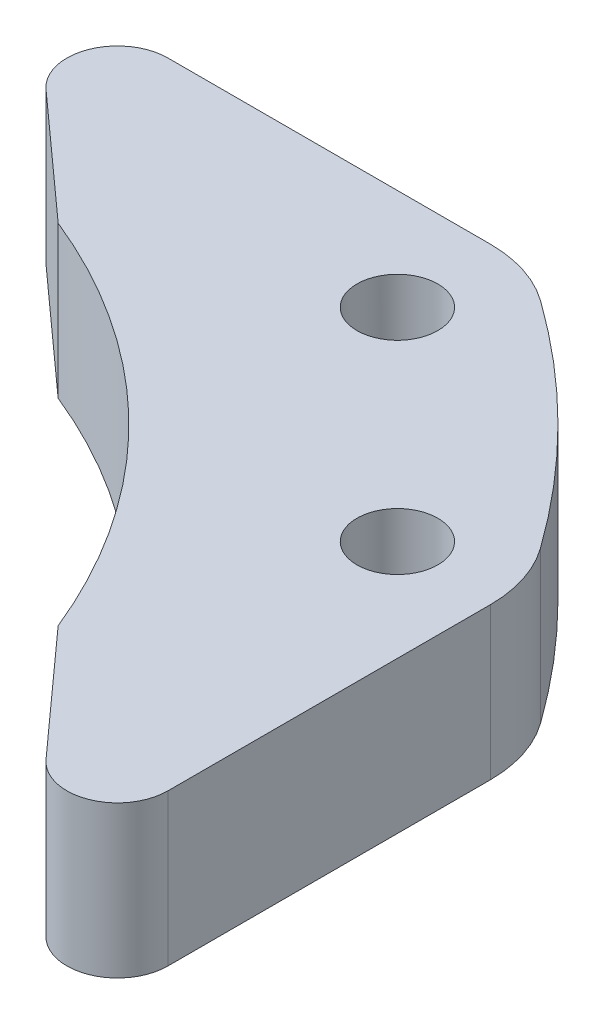
ISO-10303-21;
HEADER;
FILE_DESCRIPTION(('STEP AP214'),'2;1');
FILE_NAME('part.step','',(''),(''),'','','');
FILE_SCHEMA(('AUTOMOTIVE_DESIGN { 1 0 10303 214 1 1 1 1 }'));
ENDSEC;
DATA;
#1=APPLICATION_CONTEXT('core data for automotive mechanical design processes');
#2=APPLICATION_PROTOCOL_DEFINITION('international standard','automotive_design',2000,#1);
#3=PRODUCT_CONTEXT('',#1,'mechanical');
#4=PRODUCT('Part','Part','',(#3));
#5=PRODUCT_RELATED_PRODUCT_CATEGORY('part','',(#4));
#6=PRODUCT_DEFINITION_FORMATION('','',#4);
#7=PRODUCT_DEFINITION_CONTEXT('part definition',#1,'design');
#8=PRODUCT_DEFINITION('design','',#6,#7);
#9=PRODUCT_DEFINITION_SHAPE('','',#8);
#10=(LENGTH_UNIT() NAMED_UNIT(*) SI_UNIT(.MILLI.,.METRE.));
#11=(NAMED_UNIT(*) PLANE_ANGLE_UNIT() SI_UNIT($,.RADIAN.));
#12=(NAMED_UNIT(*) SI_UNIT($,.STERADIAN.) SOLID_ANGLE_UNIT());
#13=UNCERTAINTY_MEASURE_WITH_UNIT(LENGTH_MEASURE(1.E-05),#10,'distance_accuracy_value','');
#14=(GEOMETRIC_REPRESENTATION_CONTEXT(3) GLOBAL_UNCERTAINTY_ASSIGNED_CONTEXT((#13)) GLOBAL_UNIT_ASSIGNED_CONTEXT((#10,
#11,#12)) REPRESENTATION_CONTEXT('',''));
#15=CARTESIAN_POINT('',(0.,0.,0.));
#16=DIRECTION('',(0.,0.,1.));
#17=DIRECTION('',(1.,0.,0.));
#18=AXIS2_PLACEMENT_3D('',#15,#16,#17);
#19=CARTESIAN_POINT('',(31.,6.,-20.1990098767242));
#20=DIRECTION('',(-1.,0.,0.));
#21=DIRECTION('',(0.,0.,1.));
#22=AXIS2_PLACEMENT_3D('',#19,#20,#21);
#23=PLANE('',#22);
#24=DIRECTION('',(0.,0.,-1.));
#25=VECTOR('',#24,1.);
#26=CARTESIAN_POINT('',(31.,6.,-20.1990098767242));
#27=LINE('',#26,#25);
#28=CARTESIAN_POINT('',(31.,6.,-5.90138909150087));
#29=VERTEX_POINT('',#28);
#30=CARTESIAN_POINT('',(31.,6.,-18.6547581061776));
#31=VERTEX_POINT('',#30);
#32=EDGE_CURVE('E163',#29,#31,#27,.T.);
#33=ORIENTED_EDGE('',*,*,#32,.F.);
#34=DIRECTION('',(0.,1.,0.));
#35=VECTOR('',#34,1.);
#36=CARTESIAN_POINT('',(31.,0.,-5.90138909150087));
#37=LINE('',#36,#35);
#38=CARTESIAN_POINT('',(31.,0.,-5.90138909150087));
#39=VERTEX_POINT('',#38);
#40=EDGE_CURVE('E235',#29,#39,#37,.F.);
#41=ORIENTED_EDGE('',*,*,#40,.T.);
#42=DIRECTION('',(0.,0.,-1.));
#43=VECTOR('',#42,1.);
#44=CARTESIAN_POINT('',(31.,0.,-20.1990098767242));
#45=LINE('',#44,#43);
#46=CARTESIAN_POINT('',(31.,0.,-18.6547581061776));
#47=VERTEX_POINT('',#46);
#48=EDGE_CURVE('E174',#39,#47,#45,.T.);
#49=ORIENTED_EDGE('',*,*,#48,.T.);
#50=DIRECTION('',(0.,-1.,0.));
#51=VECTOR('',#50,1.);
#52=CARTESIAN_POINT('',(31.,6.,-18.6547581061776));
#53=LINE('',#52,#51);
#54=EDGE_CURVE('E212',#47,#31,#53,.F.);
#55=ORIENTED_EDGE('',*,*,#54,.T.);
#56=EDGE_LOOP('',(#33,#41,#49,#55));
#57=FACE_BOUND('',#56,.T.);
#58=ADVANCED_FACE('F46',(#57),#23,.F.);
#59=CARTESIAN_POINT('',(-20.1990098767242,6.,-31.));
#60=DIRECTION('',(0.,0.,1.));
#61=DIRECTION('',(1.,0.,0.));
#62=AXIS2_PLACEMENT_3D('',#59,#60,#61);
#63=PLANE('',#62);
#64=DIRECTION('',(-1.,0.,0.));
#65=VECTOR('',#64,1.);
#66=CARTESIAN_POINT('',(-20.1990098767242,0.,-31.));
#67=LINE('',#66,#65);
#68=CARTESIAN_POINT('',(18.6547581061776,0.,-31.));
#69=VERTEX_POINT('',#68);
#70=CARTESIAN_POINT('',(5.90138909150088,0.,-31.));
#71=VERTEX_POINT('',#70);
#72=EDGE_CURVE('E167',#69,#71,#67,.T.);
#73=ORIENTED_EDGE('',*,*,#72,.T.);
#74=DIRECTION('',(0.,1.,0.));
#75=VECTOR('',#74,1.);
#76=CARTESIAN_POINT('',(5.90138909150088,6.,-31.));
#77=LINE('',#76,#75);
#78=CARTESIAN_POINT('',(5.90138909150088,6.,-31.));
#79=VERTEX_POINT('',#78);
#80=EDGE_CURVE('E55',#71,#79,#77,.T.);
#81=ORIENTED_EDGE('',*,*,#80,.T.);
#82=DIRECTION('',(-1.,0.,0.));
#83=VECTOR('',#82,1.);
#84=CARTESIAN_POINT('',(-20.1990098767242,6.,-31.));
#85=LINE('',#84,#83);
#86=CARTESIAN_POINT('',(18.6547581061776,6.,-31.));
#87=VERTEX_POINT('',#86);
#88=EDGE_CURVE('E171',#87,#79,#85,.T.);
#89=ORIENTED_EDGE('',*,*,#88,.F.);
#90=DIRECTION('',(0.,-1.,0.));
#91=VECTOR('',#90,1.);
#92=CARTESIAN_POINT('',(18.6547581061776,6.,-31.));
#93=LINE('',#92,#91);
#94=EDGE_CURVE('E222',#87,#69,#93,.T.);
#95=ORIENTED_EDGE('',*,*,#94,.T.);
#96=EDGE_LOOP('',(#73,#81,#89,#95));
#97=FACE_BOUND('',#96,.T.);
#98=ADVANCED_FACE('F247',(#97),#63,.F.);
#99=CARTESIAN_POINT('',(0.,6.,0.));
#100=DIRECTION('',(0.,1.,0.));
#101=DIRECTION('',(0.,0.,1.));
#102=AXIS2_PLACEMENT_3D('',#99,#100,#101);
#103=PLANE('',#102);
#104=CARTESIAN_POINT('',(26.9989406750258,6.,-18.9751733174282));
#105=DIRECTION('',(0.,1.,0.));
#106=DIRECTION('',(0.,0.,1.));
#107=AXIS2_PLACEMENT_3D('',#104,#105,#106);
#108=CIRCLE('',#107,1.6);
#109=CARTESIAN_POINT('',(26.9989406750258,6.,-17.3751733174282));
#110=VERTEX_POINT('',#109);
#111=EDGE_CURVE('E155',#110,#110,#108,.T.);
#112=ORIENTED_EDGE('',*,*,#111,.F.);
#113=EDGE_LOOP('',(#112));
#114=FACE_BOUND('',#113,.T.);
#115=CARTESIAN_POINT('',(18.9751733174281,6.,-26.9989406750258));
#116=DIRECTION('',(0.,1.,0.));
#117=DIRECTION('',(0.,0.,-1.));
#118=AXIS2_PLACEMENT_3D('',#115,#116,#117);
#119=CIRCLE('',#118,1.60000000000001);
#120=CARTESIAN_POINT('',(18.9751733174281,6.,-28.5989406750258));
#121=VERTEX_POINT('',#120);
#122=EDGE_CURVE('E153',#121,#121,#119,.T.);
#123=ORIENTED_EDGE('',*,*,#122,.F.);
#124=EDGE_LOOP('',(#123));
#125=FACE_BOUND('',#124,.T.);
#126=DIRECTION('',(0.669130606358857,0.,0.743144825477396));
#127=VECTOR('',#126,1.);
#128=CARTESIAN_POINT('',(31.,6.,-0.691210962113258));
#129=LINE('',#128,#127);
#130=CARTESIAN_POINT('',(23.1711599330476,6.,-9.38601871706681));
#131=VERTEX_POINT('',#130);
#132=CARTESIAN_POINT('',(27.5137103490452,6.,-4.56312787878316));
#133=VERTEX_POINT('',#132);
#134=EDGE_CURVE('E141',#131,#133,#129,.T.);
#135=ORIENTED_EDGE('',*,*,#134,.T.);
#136=CARTESIAN_POINT('',(29.,6.,-5.90138909150087));
#137=DIRECTION('',(0.,1.,0.));
#138=DIRECTION('',(0.,0.,1.));
#139=AXIS2_PLACEMENT_3D('',#136,#137,#138);
#140=CIRCLE('',#139,2.);
#141=EDGE_CURVE('E232',#133,#29,#140,.T.);
#142=ORIENTED_EDGE('',*,*,#141,.T.);
#143=ORIENTED_EDGE('',*,*,#32,.T.);
#144=CARTESIAN_POINT('',(26.,6.,-18.6547581061776));
#145=DIRECTION('',(0.,1.,0.));
#146=DIRECTION('',(0.,0.,1.));
#147=AXIS2_PLACEMENT_3D('',#144,#145,#146);
#148=CIRCLE('',#147,5.);
#149=CARTESIAN_POINT('',(30.0625,6.,-21.5695640602679));
#150=VERTEX_POINT('',#149);
#151=EDGE_CURVE('E219',#31,#150,#148,.T.);
#152=ORIENTED_EDGE('',*,*,#151,.T.);
#153=CARTESIAN_POINT('',(0.,6.,0.));
#154=DIRECTION('',(0.,1.,0.));
#155=DIRECTION('',(0.,0.,1.));
#156=AXIS2_PLACEMENT_3D('',#153,#154,#155);
#157=CIRCLE('',#156,37.);
#158=CARTESIAN_POINT('',(21.5695640602679,6.,-30.0625));
#159=VERTEX_POINT('',#158);
#160=EDGE_CURVE('E166',#150,#159,#157,.T.);
#161=ORIENTED_EDGE('',*,*,#160,.T.);
#162=CARTESIAN_POINT('',(18.6547581061776,6.,-26.));
#163=DIRECTION('',(0.,1.,0.));
#164=DIRECTION('',(0.,0.,1.));
#165=AXIS2_PLACEMENT_3D('',#162,#163,#164);
#166=CIRCLE('',#165,5.);
#167=EDGE_CURVE('E216',#159,#87,#166,.T.);
#168=ORIENTED_EDGE('',*,*,#167,.T.);
#169=ORIENTED_EDGE('',*,*,#88,.T.);
#170=CARTESIAN_POINT('',(5.90138909150088,6.,-29.));
#171=DIRECTION('',(0.,1.,0.));
#172=DIRECTION('',(0.,0.,1.));
#173=AXIS2_PLACEMENT_3D('',#170,#171,#172);
#174=CIRCLE('',#173,2.);
#175=CARTESIAN_POINT('',(4.56312787878316,6.,-27.5137103490452));
#176=VERTEX_POINT('',#175);
#177=EDGE_CURVE('E130',#79,#176,#174,.T.);
#178=ORIENTED_EDGE('',*,*,#177,.T.);
#179=DIRECTION('',(0.743144825477395,0.,0.669130606358857));
#180=VECTOR('',#179,1.);
#181=CARTESIAN_POINT('',(0.691210962113255,6.,-31.));
#182=LINE('',#181,#180);
#183=CARTESIAN_POINT('',(9.38601871706681,6.,-23.1711599330476));
#184=VERTEX_POINT('',#183);
#185=EDGE_CURVE('E123',#176,#184,#182,.T.);
#186=ORIENTED_EDGE('',*,*,#185,.T.);
#187=CARTESIAN_POINT('',(0.,6.,0.));
#188=DIRECTION('',(0.,-1.,0.));
#189=DIRECTION('',(0.,0.,1.));
#190=AXIS2_PLACEMENT_3D('',#187,#188,#189);
#191=CIRCLE('',#190,25.);
#192=EDGE_CURVE('E128',#184,#131,#191,.T.);
#193=ORIENTED_EDGE('',*,*,#192,.T.);
#194=EDGE_LOOP('',(#135,#142,#143,#152,#161,#168,#169,#178,#186,#193));
#195=FACE_BOUND('',#194,.T.);
#196=ADVANCED_FACE('F126',(#114,#125,#195),#103,.T.);
#197=CARTESIAN_POINT('',(0.,0.,0.));
#198=DIRECTION('',(0.,1.,0.));
#199=DIRECTION('',(0.,0.,1.));
#200=AXIS2_PLACEMENT_3D('',#197,#198,#199);
#201=PLANE('',#200);
#202=CARTESIAN_POINT('',(18.9751733174281,0.,-26.9989406750258));
#203=DIRECTION('',(0.,1.,0.));
#204=DIRECTION('',(0.,0.,1.));
#205=AXIS2_PLACEMENT_3D('',#202,#203,#204);
#206=CIRCLE('',#205,1.60000000000001);
#207=CARTESIAN_POINT('',(18.9751733174281,0.,-25.3989406750258));
#208=VERTEX_POINT('',#207);
#209=EDGE_CURVE('E159',#208,#208,#206,.T.);
#210=ORIENTED_EDGE('',*,*,#209,.T.);
#211=EDGE_LOOP('',(#210));
#212=FACE_BOUND('',#211,.T.);
#213=CARTESIAN_POINT('',(26.9989406750258,0.,-18.9751733174282));
#214=DIRECTION('',(0.,1.,0.));
#215=DIRECTION('',(0.,0.,1.));
#216=AXIS2_PLACEMENT_3D('',#213,#214,#215);
#217=CIRCLE('',#216,1.6);
#218=CARTESIAN_POINT('',(26.9989406750258,0.,-17.3751733174282));
#219=VERTEX_POINT('',#218);
#220=EDGE_CURVE('E178',#219,#219,#217,.T.);
#221=ORIENTED_EDGE('',*,*,#220,.T.);
#222=EDGE_LOOP('',(#221));
#223=FACE_BOUND('',#222,.T.);
#224=ORIENTED_EDGE('',*,*,#48,.F.);
#225=CARTESIAN_POINT('',(29.,0.,-5.90138909150087));
#226=DIRECTION('',(0.,1.,0.));
#227=DIRECTION('',(0.,0.,1.));
#228=AXIS2_PLACEMENT_3D('',#225,#226,#227);
#229=CIRCLE('',#228,2.);
#230=CARTESIAN_POINT('',(27.5137103490452,0.,-4.56312787878316));
#231=VERTEX_POINT('',#230);
#232=EDGE_CURVE('E240',#39,#231,#229,.F.);
#233=ORIENTED_EDGE('',*,*,#232,.T.);
#234=DIRECTION('',(0.669130606358857,0.,0.743144825477396));
#235=VECTOR('',#234,1.);
#236=CARTESIAN_POINT('',(17.4639033987188,0.,-15.7245692494331));
#237=LINE('',#236,#235);
#238=CARTESIAN_POINT('',(23.1711599330476,0.,-9.38601871706681));
#239=VERTEX_POINT('',#238);
#240=EDGE_CURVE('E194',#239,#231,#237,.T.);
#241=ORIENTED_EDGE('',*,*,#240,.F.);
#242=CARTESIAN_POINT('',(0.,0.,0.));
#243=DIRECTION('',(0.,1.,0.));
#244=DIRECTION('',(0.,0.,1.));
#245=AXIS2_PLACEMENT_3D('',#242,#243,#244);
#246=CIRCLE('',#245,25.);
#247=CARTESIAN_POINT('',(9.38601871706681,0.,-23.1711599330476));
#248=VERTEX_POINT('',#247);
#249=EDGE_CURVE('E192',#248,#239,#246,.F.);
#250=ORIENTED_EDGE('',*,*,#249,.F.);
#251=DIRECTION('',(0.743144825477396,0.,0.669130606358857));
#252=VECTOR('',#251,1.);
#253=CARTESIAN_POINT('',(15.7245692494331,0.,-17.4639033987188));
#254=LINE('',#253,#252);
#255=CARTESIAN_POINT('',(4.56312787878316,0.,-27.5137103490452));
#256=VERTEX_POINT('',#255);
#257=EDGE_CURVE('E136',#256,#248,#254,.T.);
#258=ORIENTED_EDGE('',*,*,#257,.F.);
#259=CARTESIAN_POINT('',(5.90138909150088,0.,-29.));
#260=DIRECTION('',(0.,1.,0.));
#261=DIRECTION('',(0.,0.,1.));
#262=AXIS2_PLACEMENT_3D('',#259,#260,#261);
#263=CIRCLE('',#262,2.);
#264=EDGE_CURVE('E62',#256,#71,#263,.F.);
#265=ORIENTED_EDGE('',*,*,#264,.T.);
#266=ORIENTED_EDGE('',*,*,#72,.F.);
#267=CARTESIAN_POINT('',(18.6547581061776,0.,-26.));
#268=DIRECTION('',(0.,1.,0.));
#269=DIRECTION('',(0.,0.,1.));
#270=AXIS2_PLACEMENT_3D('',#267,#268,#269);
#271=CIRCLE('',#270,5.);
#272=CARTESIAN_POINT('',(21.5695640602679,0.,-30.0625));
#273=VERTEX_POINT('',#272);
#274=EDGE_CURVE('E205',#69,#273,#271,.F.);
#275=ORIENTED_EDGE('',*,*,#274,.T.);
#276=CARTESIAN_POINT('',(0.,0.,0.));
#277=DIRECTION('',(0.,1.,0.));
#278=DIRECTION('',(0.,0.,1.));
#279=AXIS2_PLACEMENT_3D('',#276,#277,#278);
#280=CIRCLE('',#279,37.);
#281=CARTESIAN_POINT('',(30.0625,0.,-21.5695640602679));
#282=VERTEX_POINT('',#281);
#283=EDGE_CURVE('E177',#282,#273,#280,.T.);
#284=ORIENTED_EDGE('',*,*,#283,.F.);
#285=CARTESIAN_POINT('',(26.,0.,-18.6547581061776));
#286=DIRECTION('',(0.,1.,0.));
#287=DIRECTION('',(0.,0.,1.));
#288=AXIS2_PLACEMENT_3D('',#285,#286,#287);
#289=CIRCLE('',#288,5.);
#290=EDGE_CURVE('E208',#282,#47,#289,.F.);
#291=ORIENTED_EDGE('',*,*,#290,.T.);
#292=EDGE_LOOP('',(#224,#233,#241,#250,#258,#265,#266,#275,#284,#291));
#293=FACE_BOUND('',#292,.T.);
#294=ADVANCED_FACE('F256',(#212,#223,#293),#201,.F.);
#295=CARTESIAN_POINT('',(0.,6.,0.));
#296=DIRECTION('',(0.,-1.,0.));
#297=DIRECTION('',(0.,0.,-1.));
#298=AXIS2_PLACEMENT_3D('',#295,#296,#297);
#299=CYLINDRICAL_SURFACE('',#298,37.);
#300=ORIENTED_EDGE('',*,*,#160,.F.);
#301=DIRECTION('',(0.,-1.,0.));
#302=VECTOR('',#301,1.);
#303=CARTESIAN_POINT('',(30.0625,6.,-21.5695640602679));
#304=LINE('',#303,#302);
#305=EDGE_CURVE('E201',#150,#282,#304,.T.);
#306=ORIENTED_EDGE('',*,*,#305,.T.);
#307=ORIENTED_EDGE('',*,*,#283,.T.);
#308=DIRECTION('',(0.,-1.,0.));
#309=VECTOR('',#308,1.);
#310=CARTESIAN_POINT('',(21.5695640602679,6.,-30.0625));
#311=LINE('',#310,#309);
#312=EDGE_CURVE('E198',#273,#159,#311,.F.);
#313=ORIENTED_EDGE('',*,*,#312,.T.);
#314=EDGE_LOOP('',(#300,#306,#307,#313));
#315=FACE_BOUND('',#314,.T.);
#316=ADVANCED_FACE('F259',(#315),#299,.T.);
#317=CARTESIAN_POINT('',(18.9751733174281,-4.,-26.9989406750258));
#318=DIRECTION('',(0.,1.,0.));
#319=DIRECTION('',(0.,0.,1.));
#320=AXIS2_PLACEMENT_3D('',#317,#318,#319);
#321=CYLINDRICAL_SURFACE('',#320,1.60000000000001);
#322=ORIENTED_EDGE('',*,*,#122,.T.);
#323=EDGE_LOOP('',(#322));
#324=FACE_BOUND('',#323,.T.);
#325=ORIENTED_EDGE('',*,*,#209,.F.);
#326=EDGE_LOOP('',(#325));
#327=FACE_BOUND('',#326,.T.);
#328=ADVANCED_FACE('F362',(#324,#327),#321,.F.);
#329=CARTESIAN_POINT('',(26.9989406750258,-4.,-18.9751733174282));
#330=DIRECTION('',(0.,1.,0.));
#331=DIRECTION('',(0.,0.,1.));
#332=AXIS2_PLACEMENT_3D('',#329,#330,#331);
#333=CYLINDRICAL_SURFACE('',#332,1.6);
#334=ORIENTED_EDGE('',*,*,#111,.T.);
#335=EDGE_LOOP('',(#334));
#336=FACE_BOUND('',#335,.T.);
#337=ORIENTED_EDGE('',*,*,#220,.F.);
#338=EDGE_LOOP('',(#337));
#339=FACE_BOUND('',#338,.T.);
#340=ADVANCED_FACE('F316',(#336,#339),#333,.F.);
#341=CARTESIAN_POINT('',(31.,-4.,-0.691210962113258));
#342=DIRECTION('',(-0.743144825477396,0.,0.669130606358857));
#343=DIRECTION('',(0.669130606358857,0.,0.743144825477396));
#344=AXIS2_PLACEMENT_3D('',#341,#342,#343);
#345=PLANE('',#344);
#346=ORIENTED_EDGE('',*,*,#240,.T.);
#347=DIRECTION('',(0.,1.,0.));
#348=VECTOR('',#347,1.);
#349=CARTESIAN_POINT('',(27.5137103490452,6.,-4.56312787878316));
#350=LINE('',#349,#348);
#351=EDGE_CURVE('E226',#231,#133,#350,.T.);
#352=ORIENTED_EDGE('',*,*,#351,.T.);
#353=ORIENTED_EDGE('',*,*,#134,.F.);
#354=DIRECTION('',(0.,1.,0.));
#355=VECTOR('',#354,1.);
#356=CARTESIAN_POINT('',(23.1711599330476,-4.,-9.38601871706681));
#357=LINE('',#356,#355);
#358=EDGE_CURVE('E140',#239,#131,#357,.T.);
#359=ORIENTED_EDGE('',*,*,#358,.F.);
#360=EDGE_LOOP('',(#346,#352,#353,#359));
#361=FACE_BOUND('',#360,.T.);
#362=ADVANCED_FACE('F273',(#361),#345,.T.);
#363=CARTESIAN_POINT('',(0.,-4.,0.));
#364=DIRECTION('',(0.,1.,0.));
#365=DIRECTION('',(0.,0.,1.));
#366=AXIS2_PLACEMENT_3D('',#363,#364,#365);
#367=CYLINDRICAL_SURFACE('',#366,25.);
#368=ORIENTED_EDGE('',*,*,#249,.T.);
#369=ORIENTED_EDGE('',*,*,#358,.T.);
#370=ORIENTED_EDGE('',*,*,#192,.F.);
#371=DIRECTION('',(0.,1.,0.));
#372=VECTOR('',#371,1.);
#373=CARTESIAN_POINT('',(9.38601871706681,-4.,-23.1711599330476));
#374=LINE('',#373,#372);
#375=EDGE_CURVE('E134',#248,#184,#374,.T.);
#376=ORIENTED_EDGE('',*,*,#375,.F.);
#377=EDGE_LOOP('',(#368,#369,#370,#376));
#378=FACE_BOUND('',#377,.T.);
#379=ADVANCED_FACE('F143',(#378),#367,.F.);
#380=CARTESIAN_POINT('',(0.691210962113255,-4.,-31.));
#381=DIRECTION('',(-0.669130606358857,0.,0.743144825477395));
#382=DIRECTION('',(0.743144825477396,0.,0.669130606358857));
#383=AXIS2_PLACEMENT_3D('',#380,#381,#382);
#384=PLANE('',#383);
#385=ORIENTED_EDGE('',*,*,#185,.F.);
#386=DIRECTION('',(0.,1.,0.));
#387=VECTOR('',#386,1.);
#388=CARTESIAN_POINT('',(4.56312787878316,0.,-27.5137103490452));
#389=LINE('',#388,#387);
#390=EDGE_CURVE('E12',#176,#256,#389,.F.);
#391=ORIENTED_EDGE('',*,*,#390,.T.);
#392=ORIENTED_EDGE('',*,*,#257,.T.);
#393=ORIENTED_EDGE('',*,*,#375,.T.);
#394=EDGE_LOOP('',(#385,#391,#392,#393));
#395=FACE_BOUND('',#394,.T.);
#396=ADVANCED_FACE('F135',(#395),#384,.T.);
#397=CARTESIAN_POINT('',(26.,6.,-18.6547581061776));
#398=DIRECTION('',(0.,-1.,0.));
#399=DIRECTION('',(0.,0.,-1.));
#400=AXIS2_PLACEMENT_3D('',#397,#398,#399);
#401=CYLINDRICAL_SURFACE('',#400,5.);
#402=ORIENTED_EDGE('',*,*,#151,.F.);
#403=ORIENTED_EDGE('',*,*,#54,.F.);
#404=ORIENTED_EDGE('',*,*,#290,.F.);
#405=ORIENTED_EDGE('',*,*,#305,.F.);
#406=EDGE_LOOP('',(#402,#403,#404,#405));
#407=FACE_BOUND('',#406,.T.);
#408=ADVANCED_FACE('F263',(#407),#401,.T.);
#409=CARTESIAN_POINT('',(18.6547581061776,6.,-26.));
#410=DIRECTION('',(0.,-1.,0.));
#411=DIRECTION('',(0.,0.,-1.));
#412=AXIS2_PLACEMENT_3D('',#409,#410,#411);
#413=CYLINDRICAL_SURFACE('',#412,5.);
#414=ORIENTED_EDGE('',*,*,#167,.F.);
#415=ORIENTED_EDGE('',*,*,#312,.F.);
#416=ORIENTED_EDGE('',*,*,#274,.F.);
#417=ORIENTED_EDGE('',*,*,#94,.F.);
#418=EDGE_LOOP('',(#414,#415,#416,#417));
#419=FACE_BOUND('',#418,.T.);
#420=ADVANCED_FACE('F254',(#419),#413,.T.);
#421=CARTESIAN_POINT('',(29.,-4.,-5.90138909150087));
#422=DIRECTION('',(0.,-1.,0.));
#423=DIRECTION('',(0.,0.,-1.));
#424=AXIS2_PLACEMENT_3D('',#421,#422,#423);
#425=CYLINDRICAL_SURFACE('',#424,2.);
#426=ORIENTED_EDGE('',*,*,#232,.F.);
#427=ORIENTED_EDGE('',*,*,#40,.F.);
#428=ORIENTED_EDGE('',*,*,#141,.F.);
#429=ORIENTED_EDGE('',*,*,#351,.F.);
#430=EDGE_LOOP('',(#426,#427,#428,#429));
#431=FACE_BOUND('',#430,.T.);
#432=ADVANCED_FACE('F271',(#431),#425,.T.);
#433=CARTESIAN_POINT('',(5.90138909150088,6.,-29.));
#434=DIRECTION('',(0.,-1.,0.));
#435=DIRECTION('',(0.,0.,-1.));
#436=AXIS2_PLACEMENT_3D('',#433,#434,#435);
#437=CYLINDRICAL_SURFACE('',#436,2.);
#438=ORIENTED_EDGE('',*,*,#264,.F.);
#439=ORIENTED_EDGE('',*,*,#390,.F.);
#440=ORIENTED_EDGE('',*,*,#177,.F.);
#441=ORIENTED_EDGE('',*,*,#80,.F.);
#442=EDGE_LOOP('',(#438,#439,#440,#441));
#443=FACE_BOUND('',#442,.T.);
#444=ADVANCED_FACE('F48',(#443),#437,.T.);
#445=CLOSED_SHELL('',(#58,#98,#196,#294,#316,#328,#340,#362,#379,#396,#408,#420,#432,#444));
#446=MANIFOLD_SOLID_BREP('B2',#445);
#447=ADVANCED_BREP_SHAPE_REPRESENTATION('',(#18,#446),#14);
#448=SHAPE_DEFINITION_REPRESENTATION(#9,#447);
ENDSEC;
END-ISO-10303-21;
